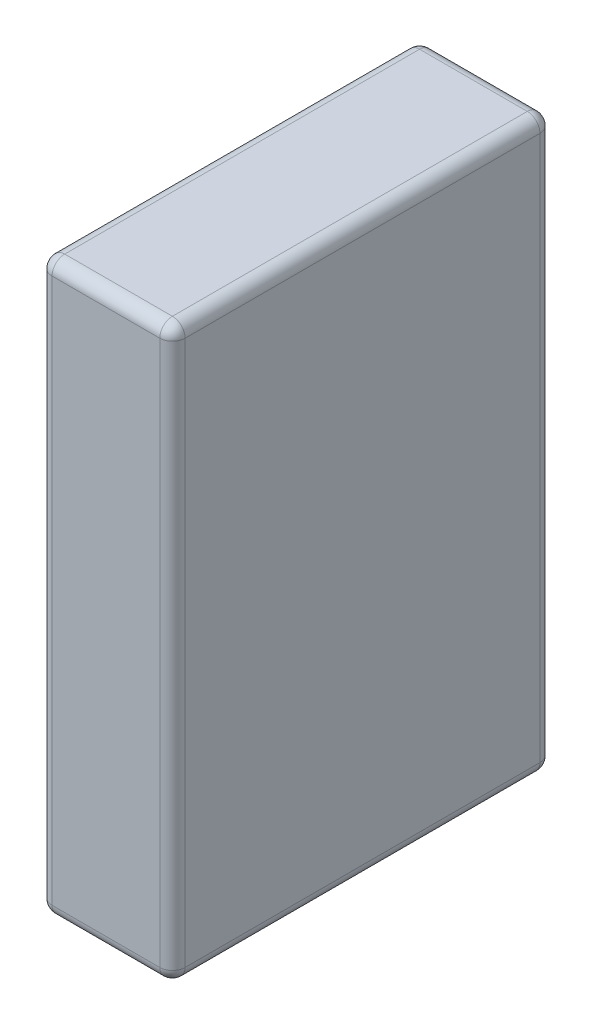
ISO-10303-21;
HEADER;
FILE_DESCRIPTION(('STEP AP214'),'2;1');
FILE_NAME('part.step','',(''),(''),'','','');
FILE_SCHEMA(('AUTOMOTIVE_DESIGN { 1 0 10303 214 1 1 1 1 }'));
ENDSEC;
DATA;
#1=APPLICATION_CONTEXT('core data for automotive mechanical design processes');
#2=APPLICATION_PROTOCOL_DEFINITION('international standard','automotive_design',2000,#1);
#3=PRODUCT_CONTEXT('',#1,'mechanical');
#4=PRODUCT('Part','Part','',(#3));
#5=PRODUCT_RELATED_PRODUCT_CATEGORY('part','',(#4));
#6=PRODUCT_DEFINITION_FORMATION('','',#4);
#7=PRODUCT_DEFINITION_CONTEXT('part definition',#1,'design');
#8=PRODUCT_DEFINITION('design','',#6,#7);
#9=PRODUCT_DEFINITION_SHAPE('','',#8);
#10=(LENGTH_UNIT() NAMED_UNIT(*) SI_UNIT(.MILLI.,.METRE.));
#11=(NAMED_UNIT(*) PLANE_ANGLE_UNIT() SI_UNIT($,.RADIAN.));
#12=(NAMED_UNIT(*) SI_UNIT($,.STERADIAN.) SOLID_ANGLE_UNIT());
#13=UNCERTAINTY_MEASURE_WITH_UNIT(LENGTH_MEASURE(1.E-05),#10,'distance_accuracy_value','');
#14=(GEOMETRIC_REPRESENTATION_CONTEXT(3) GLOBAL_UNCERTAINTY_ASSIGNED_CONTEXT((#13)) GLOBAL_UNIT_ASSIGNED_CONTEXT((#10,
#11,#12)) REPRESENTATION_CONTEXT('',''));
#15=CARTESIAN_POINT('',(0.,0.,0.));
#16=DIRECTION('',(0.,0.,1.));
#17=DIRECTION('',(1.,0.,0.));
#18=AXIS2_PLACEMENT_3D('',#15,#16,#17);
#19=CARTESIAN_POINT('',(21.,0.,0.));
#20=DIRECTION('',(0.,0.,1.));
#21=DIRECTION('',(0.,-1.,0.));
#22=AXIS2_PLACEMENT_3D('',#19,#20,#21);
#23=PLANE('',#22);
#24=CARTESIAN_POINT('',(10.5,-9.99999999999999,0.));
#25=DIRECTION('',(0.,0.,1.));
#26=DIRECTION('',(0.,-1.,0.));
#27=AXIS2_PLACEMENT_3D('',#24,#25,#26);
#28=CIRCLE('',#27,4.5);
#29=CARTESIAN_POINT('',(10.5,-14.5,0.));
#30=VERTEX_POINT('',#29);
#31=EDGE_CURVE('E253',#30,#30,#28,.T.);
#32=ORIENTED_EDGE('',*,*,#31,.T.);
#33=EDGE_LOOP('',(#32));
#34=FACE_BOUND('',#33,.T.);
#35=DIRECTION('',(0.,1.,0.));
#36=VECTOR('',#35,1.);
#37=CARTESIAN_POINT('',(19.,0.,0.));
#38=LINE('',#37,#36);
#39=CARTESIAN_POINT('',(19.,-2.,0.));
#40=VERTEX_POINT('',#39);
#41=CARTESIAN_POINT('',(19.,-88.,0.));
#42=VERTEX_POINT('',#41);
#43=EDGE_CURVE('E248',#40,#42,#38,.F.);
#44=ORIENTED_EDGE('',*,*,#43,.T.);
#45=DIRECTION('',(-1.,0.,0.));
#46=VECTOR('',#45,1.);
#47=CARTESIAN_POINT('',(21.,-88.,0.));
#48=LINE('',#47,#46);
#49=CARTESIAN_POINT('',(2.,-88.,0.));
#50=VERTEX_POINT('',#49);
#51=EDGE_CURVE('E250',#42,#50,#48,.T.);
#52=ORIENTED_EDGE('',*,*,#51,.T.);
#53=DIRECTION('',(0.,1.,0.));
#54=VECTOR('',#53,1.);
#55=CARTESIAN_POINT('',(2.,0.,0.));
#56=LINE('',#55,#54);
#57=CARTESIAN_POINT('',(2.,-2.,0.));
#58=VERTEX_POINT('',#57);
#59=EDGE_CURVE('E244',#50,#58,#56,.T.);
#60=ORIENTED_EDGE('',*,*,#59,.T.);
#61=DIRECTION('',(-1.,0.,0.));
#62=VECTOR('',#61,1.);
#63=CARTESIAN_POINT('',(21.,-2.,0.));
#64=LINE('',#63,#62);
#65=EDGE_CURVE('E246',#58,#40,#64,.F.);
#66=ORIENTED_EDGE('',*,*,#65,.T.);
#67=EDGE_LOOP('',(#44,#52,#60,#66));
#68=FACE_BOUND('',#67,.T.);
#69=ADVANCED_FACE('F39',(#34,#68),#23,.F.);
#70=CARTESIAN_POINT('',(21.,0.,0.));
#71=DIRECTION('',(0.,-1.,0.));
#72=DIRECTION('',(0.,0.,-1.));
#73=AXIS2_PLACEMENT_3D('',#70,#71,#72);
#74=PLANE('',#73);
#75=DIRECTION('',(-1.,0.,0.));
#76=VECTOR('',#75,1.);
#77=CARTESIAN_POINT('',(21.,0.,58.));
#78=LINE('',#77,#76);
#79=CARTESIAN_POINT('',(2.,0.,58.));
#80=VERTEX_POINT('',#79);
#81=CARTESIAN_POINT('',(19.,0.,58.));
#82=VERTEX_POINT('',#81);
#83=EDGE_CURVE('E231',#80,#82,#78,.F.);
#84=ORIENTED_EDGE('',*,*,#83,.T.);
#85=DIRECTION('',(0.,0.,1.));
#86=VECTOR('',#85,1.);
#87=CARTESIAN_POINT('',(19.,0.,0.));
#88=LINE('',#87,#86);
#89=CARTESIAN_POINT('',(19.,0.,2.));
#90=VERTEX_POINT('',#89);
#91=EDGE_CURVE('E233',#82,#90,#88,.F.);
#92=ORIENTED_EDGE('',*,*,#91,.T.);
#93=DIRECTION('',(-1.,0.,0.));
#94=VECTOR('',#93,1.);
#95=CARTESIAN_POINT('',(21.,0.,2.));
#96=LINE('',#95,#94);
#97=CARTESIAN_POINT('',(2.,0.,2.));
#98=VERTEX_POINT('',#97);
#99=EDGE_CURVE('E229',#90,#98,#96,.T.);
#100=ORIENTED_EDGE('',*,*,#99,.T.);
#101=DIRECTION('',(0.,0.,1.));
#102=VECTOR('',#101,1.);
#103=CARTESIAN_POINT('',(2.,0.,60.));
#104=LINE('',#103,#102);
#105=EDGE_CURVE('E227',#98,#80,#104,.T.);
#106=ORIENTED_EDGE('',*,*,#105,.T.);
#107=EDGE_LOOP('',(#84,#92,#100,#106));
#108=FACE_BOUND('',#107,.T.);
#109=ADVANCED_FACE('F321',(#108),#74,.F.);
#110=CARTESIAN_POINT('',(21.,0.,60.));
#111=DIRECTION('',(0.,0.,-1.));
#112=DIRECTION('',(0.,1.,0.));
#113=AXIS2_PLACEMENT_3D('',#110,#111,#112);
#114=PLANE('',#113);
#115=DIRECTION('',(-1.,0.,0.));
#116=VECTOR('',#115,1.);
#117=CARTESIAN_POINT('',(21.,-88.,60.));
#118=LINE('',#117,#116);
#119=CARTESIAN_POINT('',(2.,-88.,60.));
#120=VERTEX_POINT('',#119);
#121=CARTESIAN_POINT('',(19.,-88.,60.));
#122=VERTEX_POINT('',#121);
#123=EDGE_CURVE('E220',#120,#122,#118,.F.);
#124=ORIENTED_EDGE('',*,*,#123,.T.);
#125=DIRECTION('',(0.,-1.,0.));
#126=VECTOR('',#125,1.);
#127=CARTESIAN_POINT('',(19.,0.,60.));
#128=LINE('',#127,#126);
#129=CARTESIAN_POINT('',(19.,-2.,60.));
#130=VERTEX_POINT('',#129);
#131=EDGE_CURVE('E224',#122,#130,#128,.F.);
#132=ORIENTED_EDGE('',*,*,#131,.T.);
#133=DIRECTION('',(-1.,0.,0.));
#134=VECTOR('',#133,1.);
#135=CARTESIAN_POINT('',(21.,-2.,60.));
#136=LINE('',#135,#134);
#137=CARTESIAN_POINT('',(2.,-2.,60.));
#138=VERTEX_POINT('',#137);
#139=EDGE_CURVE('E222',#130,#138,#136,.T.);
#140=ORIENTED_EDGE('',*,*,#139,.T.);
#141=DIRECTION('',(0.,-1.,0.));
#142=VECTOR('',#141,1.);
#143=CARTESIAN_POINT('',(2.,-90.,60.));
#144=LINE('',#143,#142);
#145=EDGE_CURVE('E218',#138,#120,#144,.T.);
#146=ORIENTED_EDGE('',*,*,#145,.T.);
#147=EDGE_LOOP('',(#124,#132,#140,#146));
#148=FACE_BOUND('',#147,.T.);
#149=ADVANCED_FACE('F289',(#148),#114,.F.);
#150=CARTESIAN_POINT('',(21.,-90.,0.));
#151=DIRECTION('',(0.,1.,0.));
#152=DIRECTION('',(0.,0.,1.));
#153=AXIS2_PLACEMENT_3D('',#150,#151,#152);
#154=PLANE('',#153);
#155=DIRECTION('',(0.,0.,-1.));
#156=VECTOR('',#155,1.);
#157=CARTESIAN_POINT('',(19.,-90.,0.));
#158=LINE('',#157,#156);
#159=CARTESIAN_POINT('',(19.,-90.,1.99999999999999));
#160=VERTEX_POINT('',#159);
#161=CARTESIAN_POINT('',(19.,-90.,58.));
#162=VERTEX_POINT('',#161);
#163=EDGE_CURVE('E160',#160,#162,#158,.F.);
#164=ORIENTED_EDGE('',*,*,#163,.T.);
#165=DIRECTION('',(-1.,0.,0.));
#166=VECTOR('',#165,1.);
#167=CARTESIAN_POINT('',(21.,-90.,58.));
#168=LINE('',#167,#166);
#169=CARTESIAN_POINT('',(2.,-90.,58.));
#170=VERTEX_POINT('',#169);
#171=EDGE_CURVE('E241',#162,#170,#168,.T.);
#172=ORIENTED_EDGE('',*,*,#171,.T.);
#173=DIRECTION('',(0.,0.,-1.));
#174=VECTOR('',#173,1.);
#175=CARTESIAN_POINT('',(2.,-90.,0.));
#176=LINE('',#175,#174);
#177=CARTESIAN_POINT('',(2.,-90.,1.99999999999999));
#178=VERTEX_POINT('',#177);
#179=EDGE_CURVE('E236',#170,#178,#176,.T.);
#180=ORIENTED_EDGE('',*,*,#179,.T.);
#181=DIRECTION('',(-1.,0.,0.));
#182=VECTOR('',#181,1.);
#183=CARTESIAN_POINT('',(21.,-90.,1.99999999999999));
#184=LINE('',#183,#182);
#185=EDGE_CURVE('E238',#178,#160,#184,.F.);
#186=ORIENTED_EDGE('',*,*,#185,.T.);
#187=EDGE_LOOP('',(#164,#172,#180,#186));
#188=FACE_BOUND('',#187,.T.);
#189=ADVANCED_FACE('F302',(#188),#154,.F.);
#190=CARTESIAN_POINT('',(21.,0.,0.));
#191=DIRECTION('',(-1.,0.,0.));
#192=DIRECTION('',(0.,0.,1.));
#193=AXIS2_PLACEMENT_3D('',#190,#191,#192);
#194=PLANE('',#193);
#195=DIRECTION('',(0.,0.,1.));
#196=VECTOR('',#195,1.);
#197=CARTESIAN_POINT('',(21.,-2.,0.));
#198=LINE('',#197,#196);
#199=CARTESIAN_POINT('',(21.,-2.,2.));
#200=VERTEX_POINT('',#199);
#201=CARTESIAN_POINT('',(21.,-2.,58.));
#202=VERTEX_POINT('',#201);
#203=EDGE_CURVE('E137',#200,#202,#198,.T.);
#204=ORIENTED_EDGE('',*,*,#203,.T.);
#205=DIRECTION('',(0.,-1.,0.));
#206=VECTOR('',#205,1.);
#207=CARTESIAN_POINT('',(21.,0.,58.));
#208=LINE('',#207,#206);
#209=CARTESIAN_POINT('',(21.,-88.,58.));
#210=VERTEX_POINT('',#209);
#211=EDGE_CURVE('E133',#202,#210,#208,.T.);
#212=ORIENTED_EDGE('',*,*,#211,.T.);
#213=DIRECTION('',(0.,0.,-1.));
#214=VECTOR('',#213,1.);
#215=CARTESIAN_POINT('',(21.,-88.,0.));
#216=LINE('',#215,#214);
#217=CARTESIAN_POINT('',(21.,-88.,1.99999999999999));
#218=VERTEX_POINT('',#217);
#219=EDGE_CURVE('E127',#210,#218,#216,.T.);
#220=ORIENTED_EDGE('',*,*,#219,.T.);
#221=DIRECTION('',(0.,1.,0.));
#222=VECTOR('',#221,1.);
#223=CARTESIAN_POINT('',(21.,0.,2.));
#224=LINE('',#223,#222);
#225=EDGE_CURVE('E130',#218,#200,#224,.T.);
#226=ORIENTED_EDGE('',*,*,#225,.T.);
#227=EDGE_LOOP('',(#204,#212,#220,#226));
#228=FACE_BOUND('',#227,.T.);
#229=ADVANCED_FACE('F129',(#228),#194,.F.);
#230=CARTESIAN_POINT('',(0.,0.,0.));
#231=DIRECTION('',(-1.,0.,0.));
#232=DIRECTION('',(0.,0.,1.));
#233=AXIS2_PLACEMENT_3D('',#230,#231,#232);
#234=PLANE('',#233);
#235=DIRECTION('',(0.,-1.,0.));
#236=VECTOR('',#235,1.);
#237=CARTESIAN_POINT('',(0.,0.,58.));
#238=LINE('',#237,#236);
#239=CARTESIAN_POINT('',(0.,-88.,58.));
#240=VERTEX_POINT('',#239);
#241=CARTESIAN_POINT('',(0.,-2.,58.));
#242=VERTEX_POINT('',#241);
#243=EDGE_CURVE('E48',#240,#242,#238,.F.);
#244=ORIENTED_EDGE('',*,*,#243,.T.);
#245=DIRECTION('',(0.,0.,1.));
#246=VECTOR('',#245,1.);
#247=CARTESIAN_POINT('',(0.,-2.,0.));
#248=LINE('',#247,#246);
#249=CARTESIAN_POINT('',(0.,-2.,2.));
#250=VERTEX_POINT('',#249);
#251=EDGE_CURVE('E11',#242,#250,#248,.F.);
#252=ORIENTED_EDGE('',*,*,#251,.T.);
#253=DIRECTION('',(0.,1.,0.));
#254=VECTOR('',#253,1.);
#255=CARTESIAN_POINT('',(0.,-90.,1.99999999999999));
#256=LINE('',#255,#254);
#257=CARTESIAN_POINT('',(0.,-88.,1.99999999999999));
#258=VERTEX_POINT('',#257);
#259=EDGE_CURVE('E259',#250,#258,#256,.F.);
#260=ORIENTED_EDGE('',*,*,#259,.T.);
#261=DIRECTION('',(0.,0.,-1.));
#262=VECTOR('',#261,1.);
#263=CARTESIAN_POINT('',(0.,-88.,60.));
#264=LINE('',#263,#262);
#265=EDGE_CURVE('E59',#258,#240,#264,.F.);
#266=ORIENTED_EDGE('',*,*,#265,.T.);
#267=EDGE_LOOP('',(#244,#252,#260,#266));
#268=FACE_BOUND('',#267,.T.);
#269=ADVANCED_FACE('F574',(#268),#234,.T.);
#270=CARTESIAN_POINT('',(10.5,-9.99999999999999,5.));
#271=DIRECTION('',(0.,0.,-1.));
#272=DIRECTION('',(0.,1.,0.));
#273=AXIS2_PLACEMENT_3D('',#270,#271,#272);
#274=CYLINDRICAL_SURFACE('',#273,2.5);
#275=CARTESIAN_POINT('',(10.5,-9.99999999999999,2.));
#276=DIRECTION('',(0.,0.,1.));
#277=DIRECTION('',(0.,-1.,0.));
#278=AXIS2_PLACEMENT_3D('',#275,#276,#277);
#279=CIRCLE('',#278,2.5);
#280=CARTESIAN_POINT('',(10.5,-12.5,2.));
#281=VERTEX_POINT('',#280);
#282=EDGE_CURVE('E256',#281,#281,#279,.F.);
#283=ORIENTED_EDGE('',*,*,#282,.T.);
#284=EDGE_LOOP('',(#283));
#285=FACE_BOUND('',#284,.T.);
#286=CARTESIAN_POINT('',(10.5,-9.99999999999999,5.));
#287=DIRECTION('',(0.,0.,-1.));
#288=DIRECTION('',(0.,1.,0.));
#289=AXIS2_PLACEMENT_3D('',#286,#287,#288);
#290=CIRCLE('',#289,2.5);
#291=CARTESIAN_POINT('',(10.5,-7.49999999999999,5.));
#292=VERTEX_POINT('',#291);
#293=EDGE_CURVE('E149',#292,#292,#290,.T.);
#294=ORIENTED_EDGE('',*,*,#293,.F.);
#295=EDGE_LOOP('',(#294));
#296=FACE_BOUND('',#295,.T.);
#297=ADVANCED_FACE('F565',(#285,#296),#274,.F.);
#298=CARTESIAN_POINT('',(10.5,-9.99999999999999,5.));
#299=DIRECTION('',(0.,0.,-1.));
#300=DIRECTION('',(0.,1.,0.));
#301=AXIS2_PLACEMENT_3D('',#298,#299,#300);
#302=PLANE('',#301);
#303=ORIENTED_EDGE('',*,*,#293,.T.);
#304=EDGE_LOOP('',(#303));
#305=FACE_BOUND('',#304,.T.);
#306=ADVANCED_FACE('F554',(#305),#302,.T.);
#307=CARTESIAN_POINT('',(2.,0.,2.));
#308=DIRECTION('',(0.,-1.,0.));
#309=DIRECTION('',(0.,0.,-1.));
#310=AXIS2_PLACEMENT_3D('',#307,#308,#309);
#311=CYLINDRICAL_SURFACE('',#310,2.);
#312=CARTESIAN_POINT('',(2.,-2.,2.));
#313=DIRECTION('',(0.,1.,0.));
#314=DIRECTION('',(0.,0.,1.));
#315=AXIS2_PLACEMENT_3D('',#312,#313,#314);
#316=CIRCLE('',#315,2.);
#317=EDGE_CURVE('E43',#58,#250,#316,.T.);
#318=ORIENTED_EDGE('',*,*,#317,.F.);
#319=ORIENTED_EDGE('',*,*,#59,.F.);
#320=CARTESIAN_POINT('',(2.,-88.,1.99999999999999));
#321=DIRECTION('',(0.,-1.,0.));
#322=DIRECTION('',(0.,0.,-1.));
#323=AXIS2_PLACEMENT_3D('',#320,#321,#322);
#324=CIRCLE('',#323,2.);
#325=EDGE_CURVE('E198',#258,#50,#324,.T.);
#326=ORIENTED_EDGE('',*,*,#325,.F.);
#327=ORIENTED_EDGE('',*,*,#259,.F.);
#328=EDGE_LOOP('',(#318,#319,#326,#327));
#329=FACE_BOUND('',#328,.T.);
#330=ADVANCED_FACE('F346',(#329),#311,.T.);
#331=CARTESIAN_POINT('',(2.,-2.,2.));
#332=DIRECTION('',(-1.,0.,0.));
#333=DIRECTION('',(0.,0.,1.));
#334=AXIS2_PLACEMENT_3D('',#331,#332,#333);
#335=SPHERICAL_SURFACE('',#334,2.);
#336=CARTESIAN_POINT('',(2.,-2.,2.));
#337=DIRECTION('',(-1.,0.,0.));
#338=DIRECTION('',(0.,0.,1.));
#339=AXIS2_PLACEMENT_3D('',#336,#337,#338);
#340=CIRCLE('',#339,2.);
#341=EDGE_CURVE('E194',#58,#98,#340,.F.);
#342=ORIENTED_EDGE('',*,*,#341,.F.);
#343=ORIENTED_EDGE('',*,*,#317,.T.);
#344=CARTESIAN_POINT('',(2.,-2.,2.));
#345=DIRECTION('',(0.,0.,-1.));
#346=DIRECTION('',(0.,1.,0.));
#347=AXIS2_PLACEMENT_3D('',#344,#345,#346);
#348=CIRCLE('',#347,2.);
#349=EDGE_CURVE('E197',#98,#250,#348,.F.);
#350=ORIENTED_EDGE('',*,*,#349,.F.);
#351=EDGE_LOOP('',(#342,#343,#350));
#352=FACE_BOUND('',#351,.T.);
#353=ADVANCED_FACE('F339',(#352),#335,.T.);
#354=CARTESIAN_POINT('',(2.,-88.,1.99999999999999));
#355=DIRECTION('',(0.,0.,-1.));
#356=DIRECTION('',(0.,1.,0.));
#357=AXIS2_PLACEMENT_3D('',#354,#355,#356);
#358=SPHERICAL_SURFACE('',#357,2.);
#359=CARTESIAN_POINT('',(2.,-88.,1.99999999999999));
#360=DIRECTION('',(0.,0.,-1.));
#361=DIRECTION('',(-1.,0.,0.));
#362=AXIS2_PLACEMENT_3D('',#359,#360,#361);
#363=CIRCLE('',#362,2.);
#364=EDGE_CURVE('E189',#258,#178,#363,.F.);
#365=ORIENTED_EDGE('',*,*,#364,.F.);
#366=ORIENTED_EDGE('',*,*,#325,.T.);
#367=CARTESIAN_POINT('',(2.,-88.,1.99999999999999));
#368=DIRECTION('',(-1.,0.,0.));
#369=DIRECTION('',(0.,0.,1.));
#370=AXIS2_PLACEMENT_3D('',#367,#368,#369);
#371=CIRCLE('',#370,2.);
#372=EDGE_CURVE('E192',#178,#50,#371,.F.);
#373=ORIENTED_EDGE('',*,*,#372,.F.);
#374=EDGE_LOOP('',(#365,#366,#373));
#375=FACE_BOUND('',#374,.T.);
#376=ADVANCED_FACE('F337',(#375),#358,.T.);
#377=CARTESIAN_POINT('',(2.,-2.,0.));
#378=DIRECTION('',(0.,0.,-1.));
#379=DIRECTION('',(-1.,0.,0.));
#380=AXIS2_PLACEMENT_3D('',#377,#378,#379);
#381=CYLINDRICAL_SURFACE('',#380,2.);
#382=ORIENTED_EDGE('',*,*,#349,.T.);
#383=ORIENTED_EDGE('',*,*,#251,.F.);
#384=CARTESIAN_POINT('',(2.,-2.,58.));
#385=DIRECTION('',(0.,0.,1.));
#386=DIRECTION('',(1.,0.,0.));
#387=AXIS2_PLACEMENT_3D('',#384,#385,#386);
#388=CIRCLE('',#387,2.);
#389=EDGE_CURVE('E183',#80,#242,#388,.T.);
#390=ORIENTED_EDGE('',*,*,#389,.F.);
#391=ORIENTED_EDGE('',*,*,#105,.F.);
#392=EDGE_LOOP('',(#382,#383,#390,#391));
#393=FACE_BOUND('',#392,.T.);
#394=ADVANCED_FACE('F325',(#393),#381,.T.);
#395=CARTESIAN_POINT('',(21.,-2.,2.));
#396=DIRECTION('',(-1.,0.,0.));
#397=DIRECTION('',(0.,0.,1.));
#398=AXIS2_PLACEMENT_3D('',#395,#396,#397);
#399=CYLINDRICAL_SURFACE('',#398,2.);
#400=ORIENTED_EDGE('',*,*,#341,.T.);
#401=ORIENTED_EDGE('',*,*,#99,.F.);
#402=CARTESIAN_POINT('',(19.,-2.,2.));
#403=DIRECTION('',(1.,0.,0.));
#404=DIRECTION('',(0.,0.,-1.));
#405=AXIS2_PLACEMENT_3D('',#402,#403,#404);
#406=CIRCLE('',#405,2.);
#407=EDGE_CURVE('E180',#40,#90,#406,.T.);
#408=ORIENTED_EDGE('',*,*,#407,.F.);
#409=ORIENTED_EDGE('',*,*,#65,.F.);
#410=EDGE_LOOP('',(#400,#401,#408,#409));
#411=FACE_BOUND('',#410,.T.);
#412=ADVANCED_FACE('F313',(#411),#399,.T.);
#413=CARTESIAN_POINT('',(19.,0.,2.));
#414=DIRECTION('',(0.,1.,0.));
#415=DIRECTION('',(0.,0.,1.));
#416=AXIS2_PLACEMENT_3D('',#413,#414,#415);
#417=CYLINDRICAL_SURFACE('',#416,2.);
#418=CARTESIAN_POINT('',(19.,-88.,1.99999999999999));
#419=DIRECTION('',(0.,-1.,0.));
#420=DIRECTION('',(1.,0.,0.));
#421=AXIS2_PLACEMENT_3D('',#418,#419,#420);
#422=CIRCLE('',#421,2.);
#423=EDGE_CURVE('E144',#42,#218,#422,.T.);
#424=ORIENTED_EDGE('',*,*,#423,.F.);
#425=ORIENTED_EDGE('',*,*,#43,.F.);
#426=CARTESIAN_POINT('',(19.,-2.,2.));
#427=DIRECTION('',(0.,1.,0.));
#428=DIRECTION('',(0.,0.,1.));
#429=AXIS2_PLACEMENT_3D('',#426,#427,#428);
#430=CIRCLE('',#429,2.);
#431=EDGE_CURVE('E147',#200,#40,#430,.T.);
#432=ORIENTED_EDGE('',*,*,#431,.F.);
#433=ORIENTED_EDGE('',*,*,#225,.F.);
#434=EDGE_LOOP('',(#424,#425,#432,#433));
#435=FACE_BOUND('',#434,.T.);
#436=ADVANCED_FACE('F142',(#435),#417,.T.);
#437=CARTESIAN_POINT('',(21.,-88.,1.99999999999999));
#438=DIRECTION('',(-1.,0.,0.));
#439=DIRECTION('',(0.,0.,1.));
#440=AXIS2_PLACEMENT_3D('',#437,#438,#439);
#441=CYLINDRICAL_SURFACE('',#440,2.);
#442=ORIENTED_EDGE('',*,*,#372,.T.);
#443=ORIENTED_EDGE('',*,*,#51,.F.);
#444=CARTESIAN_POINT('',(19.,-88.,1.99999999999999));
#445=DIRECTION('',(1.,0.,0.));
#446=DIRECTION('',(0.,0.,-1.));
#447=AXIS2_PLACEMENT_3D('',#444,#445,#446);
#448=CIRCLE('',#447,2.);
#449=EDGE_CURVE('E157',#160,#42,#448,.T.);
#450=ORIENTED_EDGE('',*,*,#449,.F.);
#451=ORIENTED_EDGE('',*,*,#185,.F.);
#452=EDGE_LOOP('',(#442,#443,#450,#451));
#453=FACE_BOUND('',#452,.T.);
#454=ADVANCED_FACE('F307',(#453),#441,.T.);
#455=CARTESIAN_POINT('',(2.,-88.,0.));
#456=DIRECTION('',(0.,0.,1.));
#457=DIRECTION('',(1.,0.,0.));
#458=AXIS2_PLACEMENT_3D('',#455,#456,#457);
#459=CYLINDRICAL_SURFACE('',#458,2.);
#460=ORIENTED_EDGE('',*,*,#364,.T.);
#461=ORIENTED_EDGE('',*,*,#179,.F.);
#462=CARTESIAN_POINT('',(2.,-88.,58.));
#463=DIRECTION('',(0.,0.,1.));
#464=DIRECTION('',(1.,0.,0.));
#465=AXIS2_PLACEMENT_3D('',#462,#463,#464);
#466=CIRCLE('',#465,2.);
#467=EDGE_CURVE('E175',#240,#170,#466,.T.);
#468=ORIENTED_EDGE('',*,*,#467,.F.);
#469=ORIENTED_EDGE('',*,*,#265,.F.);
#470=EDGE_LOOP('',(#460,#461,#468,#469));
#471=FACE_BOUND('',#470,.T.);
#472=ADVANCED_FACE('F336',(#471),#459,.T.);
#473=CARTESIAN_POINT('',(2.,0.,58.));
#474=DIRECTION('',(0.,1.,0.));
#475=DIRECTION('',(0.,0.,1.));
#476=AXIS2_PLACEMENT_3D('',#473,#474,#475);
#477=CYLINDRICAL_SURFACE('',#476,2.);
#478=CARTESIAN_POINT('',(2.,-2.,58.));
#479=DIRECTION('',(0.,1.,0.));
#480=DIRECTION('',(0.,0.,1.));
#481=AXIS2_PLACEMENT_3D('',#478,#479,#480);
#482=CIRCLE('',#481,2.);
#483=EDGE_CURVE('E186',#242,#138,#482,.T.);
#484=ORIENTED_EDGE('',*,*,#483,.F.);
#485=ORIENTED_EDGE('',*,*,#243,.F.);
#486=CARTESIAN_POINT('',(2.,-88.,58.));
#487=DIRECTION('',(0.,-1.,0.));
#488=DIRECTION('',(0.,0.,-1.));
#489=AXIS2_PLACEMENT_3D('',#486,#487,#488);
#490=CIRCLE('',#489,2.);
#491=EDGE_CURVE('E172',#120,#240,#490,.T.);
#492=ORIENTED_EDGE('',*,*,#491,.F.);
#493=ORIENTED_EDGE('',*,*,#145,.F.);
#494=EDGE_LOOP('',(#484,#485,#492,#493));
#495=FACE_BOUND('',#494,.T.);
#496=ADVANCED_FACE('F330',(#495),#477,.T.);
#497=CARTESIAN_POINT('',(2.,-2.,58.));
#498=DIRECTION('',(-1.,0.,0.));
#499=DIRECTION('',(0.,0.,1.));
#500=AXIS2_PLACEMENT_3D('',#497,#498,#499);
#501=SPHERICAL_SURFACE('',#500,2.);
#502=ORIENTED_EDGE('',*,*,#389,.T.);
#503=ORIENTED_EDGE('',*,*,#483,.T.);
#504=CARTESIAN_POINT('',(2.,-2.,58.));
#505=DIRECTION('',(-1.,0.,0.));
#506=DIRECTION('',(0.,0.,1.));
#507=AXIS2_PLACEMENT_3D('',#504,#505,#506);
#508=CIRCLE('',#507,2.);
#509=EDGE_CURVE('E164',#80,#138,#508,.F.);
#510=ORIENTED_EDGE('',*,*,#509,.F.);
#511=EDGE_LOOP('',(#502,#503,#510));
#512=FACE_BOUND('',#511,.T.);
#513=ADVANCED_FACE('F328',(#512),#501,.T.);
#514=CARTESIAN_POINT('',(19.,-2.,2.));
#515=DIRECTION('',(0.,0.,-1.));
#516=DIRECTION('',(0.,1.,0.));
#517=AXIS2_PLACEMENT_3D('',#514,#515,#516);
#518=SPHERICAL_SURFACE('',#517,2.);
#519=ORIENTED_EDGE('',*,*,#431,.T.);
#520=ORIENTED_EDGE('',*,*,#407,.T.);
#521=CARTESIAN_POINT('',(19.,-2.,2.));
#522=DIRECTION('',(0.,0.,-1.));
#523=DIRECTION('',(-1.,0.,0.));
#524=AXIS2_PLACEMENT_3D('',#521,#522,#523);
#525=CIRCLE('',#524,2.);
#526=EDGE_CURVE('E161',#200,#90,#525,.F.);
#527=ORIENTED_EDGE('',*,*,#526,.F.);
#528=EDGE_LOOP('',(#519,#520,#527));
#529=FACE_BOUND('',#528,.T.);
#530=ADVANCED_FACE('F315',(#529),#518,.T.);
#531=CARTESIAN_POINT('',(19.,-88.,1.99999999999999));
#532=DIRECTION('',(0.,0.,-1.));
#533=DIRECTION('',(0.,1.,0.));
#534=AXIS2_PLACEMENT_3D('',#531,#532,#533);
#535=SPHERICAL_SURFACE('',#534,2.);
#536=ORIENTED_EDGE('',*,*,#449,.T.);
#537=ORIENTED_EDGE('',*,*,#423,.T.);
#538=CARTESIAN_POINT('',(19.,-88.,1.99999999999999));
#539=DIRECTION('',(0.,0.,-1.));
#540=DIRECTION('',(-1.,0.,0.));
#541=AXIS2_PLACEMENT_3D('',#538,#539,#540);
#542=CIRCLE('',#541,2.);
#543=EDGE_CURVE('E154',#160,#218,#542,.F.);
#544=ORIENTED_EDGE('',*,*,#543,.F.);
#545=EDGE_LOOP('',(#536,#537,#544));
#546=FACE_BOUND('',#545,.T.);
#547=ADVANCED_FACE('F153',(#546),#535,.T.);
#548=CARTESIAN_POINT('',(2.,-88.,58.));
#549=DIRECTION('',(-1.,0.,0.));
#550=DIRECTION('',(0.,0.,1.));
#551=AXIS2_PLACEMENT_3D('',#548,#549,#550);
#552=SPHERICAL_SURFACE('',#551,2.);
#553=ORIENTED_EDGE('',*,*,#491,.T.);
#554=ORIENTED_EDGE('',*,*,#467,.T.);
#555=CARTESIAN_POINT('',(2.,-88.,58.));
#556=DIRECTION('',(-1.,0.,0.));
#557=DIRECTION('',(0.,0.,1.));
#558=AXIS2_PLACEMENT_3D('',#555,#556,#557);
#559=CIRCLE('',#558,2.);
#560=EDGE_CURVE('E162',#120,#170,#559,.F.);
#561=ORIENTED_EDGE('',*,*,#560,.F.);
#562=EDGE_LOOP('',(#553,#554,#561));
#563=FACE_BOUND('',#562,.T.);
#564=ADVANCED_FACE('F334',(#563),#552,.T.);
#565=CARTESIAN_POINT('',(21.,-2.,58.));
#566=DIRECTION('',(-1.,0.,0.));
#567=DIRECTION('',(0.,0.,1.));
#568=AXIS2_PLACEMENT_3D('',#565,#566,#567);
#569=CYLINDRICAL_SURFACE('',#568,2.);
#570=ORIENTED_EDGE('',*,*,#509,.T.);
#571=ORIENTED_EDGE('',*,*,#139,.F.);
#572=CARTESIAN_POINT('',(19.,-2.,58.));
#573=DIRECTION('',(1.,0.,0.));
#574=DIRECTION('',(0.,0.,-1.));
#575=AXIS2_PLACEMENT_3D('',#572,#573,#574);
#576=CIRCLE('',#575,2.);
#577=EDGE_CURVE('E166',#82,#130,#576,.T.);
#578=ORIENTED_EDGE('',*,*,#577,.F.);
#579=ORIENTED_EDGE('',*,*,#83,.F.);
#580=EDGE_LOOP('',(#570,#571,#578,#579));
#581=FACE_BOUND('',#580,.T.);
#582=ADVANCED_FACE('F284',(#581),#569,.T.);
#583=CARTESIAN_POINT('',(19.,-2.,0.));
#584=DIRECTION('',(0.,0.,1.));
#585=DIRECTION('',(1.,0.,0.));
#586=AXIS2_PLACEMENT_3D('',#583,#584,#585);
#587=CYLINDRICAL_SURFACE('',#586,2.);
#588=ORIENTED_EDGE('',*,*,#526,.T.);
#589=ORIENTED_EDGE('',*,*,#91,.F.);
#590=CARTESIAN_POINT('',(19.,-2.,58.));
#591=DIRECTION('',(0.,0.,1.));
#592=DIRECTION('',(1.,0.,0.));
#593=AXIS2_PLACEMENT_3D('',#590,#591,#592);
#594=CIRCLE('',#593,2.);
#595=EDGE_CURVE('E273',#202,#82,#594,.T.);
#596=ORIENTED_EDGE('',*,*,#595,.F.);
#597=ORIENTED_EDGE('',*,*,#203,.F.);
#598=EDGE_LOOP('',(#588,#589,#596,#597));
#599=FACE_BOUND('',#598,.T.);
#600=ADVANCED_FACE('F319',(#599),#587,.T.);
#601=CARTESIAN_POINT('',(19.,-88.,0.));
#602=DIRECTION('',(0.,0.,-1.));
#603=DIRECTION('',(-1.,0.,0.));
#604=AXIS2_PLACEMENT_3D('',#601,#602,#603);
#605=CYLINDRICAL_SURFACE('',#604,2.);
#606=ORIENTED_EDGE('',*,*,#543,.T.);
#607=ORIENTED_EDGE('',*,*,#219,.F.);
#608=CARTESIAN_POINT('',(19.,-88.,58.));
#609=DIRECTION('',(0.,0.,1.));
#610=DIRECTION('',(1.,0.,0.));
#611=AXIS2_PLACEMENT_3D('',#608,#609,#610);
#612=CIRCLE('',#611,2.);
#613=EDGE_CURVE('E270',#162,#210,#612,.T.);
#614=ORIENTED_EDGE('',*,*,#613,.F.);
#615=ORIENTED_EDGE('',*,*,#163,.F.);
#616=EDGE_LOOP('',(#606,#607,#614,#615));
#617=FACE_BOUND('',#616,.T.);
#618=ADVANCED_FACE('F159',(#617),#605,.T.);
#619=CARTESIAN_POINT('',(21.,-88.,58.));
#620=DIRECTION('',(-1.,0.,0.));
#621=DIRECTION('',(0.,0.,1.));
#622=AXIS2_PLACEMENT_3D('',#619,#620,#621);
#623=CYLINDRICAL_SURFACE('',#622,2.);
#624=ORIENTED_EDGE('',*,*,#560,.T.);
#625=ORIENTED_EDGE('',*,*,#171,.F.);
#626=CARTESIAN_POINT('',(19.,-88.,58.));
#627=DIRECTION('',(1.,0.,0.));
#628=DIRECTION('',(0.,0.,-1.));
#629=AXIS2_PLACEMENT_3D('',#626,#627,#628);
#630=CIRCLE('',#629,2.);
#631=EDGE_CURVE('E267',#122,#162,#630,.T.);
#632=ORIENTED_EDGE('',*,*,#631,.F.);
#633=ORIENTED_EDGE('',*,*,#123,.F.);
#634=EDGE_LOOP('',(#624,#625,#632,#633));
#635=FACE_BOUND('',#634,.T.);
#636=ADVANCED_FACE('F299',(#635),#623,.T.);
#637=CARTESIAN_POINT('',(19.,-2.,58.));
#638=DIRECTION('',(0.,1.,0.));
#639=DIRECTION('',(0.,0.,1.));
#640=AXIS2_PLACEMENT_3D('',#637,#638,#639);
#641=SPHERICAL_SURFACE('',#640,2.);
#642=ORIENTED_EDGE('',*,*,#595,.T.);
#643=ORIENTED_EDGE('',*,*,#577,.T.);
#644=CARTESIAN_POINT('',(19.,-2.,58.));
#645=DIRECTION('',(0.,1.,0.));
#646=DIRECTION('',(-1.,0.,0.));
#647=AXIS2_PLACEMENT_3D('',#644,#645,#646);
#648=CIRCLE('',#647,2.);
#649=EDGE_CURVE('E265',#202,#130,#648,.F.);
#650=ORIENTED_EDGE('',*,*,#649,.F.);
#651=EDGE_LOOP('',(#642,#643,#650));
#652=FACE_BOUND('',#651,.T.);
#653=ADVANCED_FACE('F280',(#652),#641,.T.);
#654=CARTESIAN_POINT('',(19.,-88.,58.));
#655=DIRECTION('',(0.,-1.,0.));
#656=DIRECTION('',(0.,0.,-1.));
#657=AXIS2_PLACEMENT_3D('',#654,#655,#656);
#658=SPHERICAL_SURFACE('',#657,2.);
#659=ORIENTED_EDGE('',*,*,#631,.T.);
#660=ORIENTED_EDGE('',*,*,#613,.T.);
#661=CARTESIAN_POINT('',(19.,-88.,58.));
#662=DIRECTION('',(0.,-1.,0.));
#663=DIRECTION('',(0.,0.,-1.));
#664=AXIS2_PLACEMENT_3D('',#661,#662,#663);
#665=CIRCLE('',#664,2.);
#666=EDGE_CURVE('E263',#122,#210,#665,.F.);
#667=ORIENTED_EDGE('',*,*,#666,.F.);
#668=EDGE_LOOP('',(#659,#660,#667));
#669=FACE_BOUND('',#668,.T.);
#670=ADVANCED_FACE('F296',(#669),#658,.T.);
#671=CARTESIAN_POINT('',(19.,0.,58.));
#672=DIRECTION('',(0.,-1.,0.));
#673=DIRECTION('',(0.,0.,-1.));
#674=AXIS2_PLACEMENT_3D('',#671,#672,#673);
#675=CYLINDRICAL_SURFACE('',#674,2.);
#676=ORIENTED_EDGE('',*,*,#649,.T.);
#677=ORIENTED_EDGE('',*,*,#131,.F.);
#678=ORIENTED_EDGE('',*,*,#666,.T.);
#679=ORIENTED_EDGE('',*,*,#211,.F.);
#680=EDGE_LOOP('',(#676,#677,#678,#679));
#681=FACE_BOUND('',#680,.T.);
#682=ADVANCED_FACE('F294',(#681),#675,.T.);
#683=CARTESIAN_POINT('',(10.5,-9.99999999999999,2.));
#684=DIRECTION('',(0.,0.,1.));
#685=DIRECTION('',(0.,-1.,0.));
#686=AXIS2_PLACEMENT_3D('',#683,#684,#685);
#687=TOROIDAL_SURFACE('',#686,4.5,2.);
#688=ORIENTED_EDGE('',*,*,#31,.F.);
#689=EDGE_LOOP('',(#688));
#690=FACE_BOUND('',#689,.T.);
#691=ORIENTED_EDGE('',*,*,#282,.F.);
#692=EDGE_LOOP('',(#691));
#693=FACE_BOUND('',#692,.T.);
#694=ADVANCED_FACE('F41',(#690,#693),#687,.T.);
#695=CLOSED_SHELL('',(#69,#109,#149,#189,#229,#269,#297,#306,#330,#353,#376,#394,#412,#436,#454,
#472,#496,#513,#530,#547,#564,#582,#600,#618,#636,#653,#670,#682,#694));
#696=MANIFOLD_SOLID_BREP('B2',#695);
#697=ADVANCED_BREP_SHAPE_REPRESENTATION('',(#18,#696),#14);
#698=SHAPE_DEFINITION_REPRESENTATION(#9,#697);
ENDSEC;
END-ISO-10303-21;
